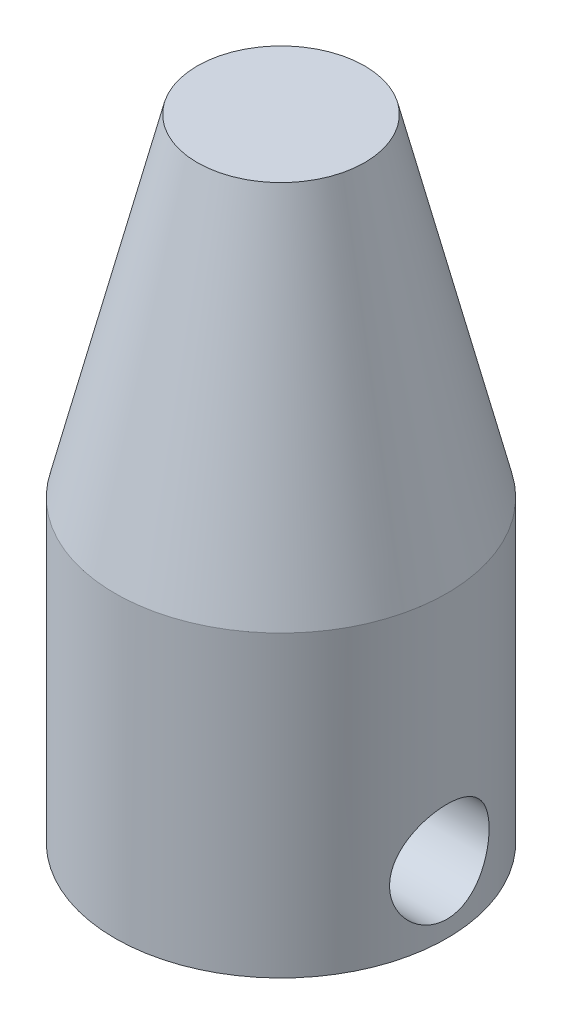
ISO-10303-21;
HEADER;
FILE_DESCRIPTION(('STEP AP214'),'2;1');
FILE_NAME('part.step','',(''),(''),'','','');
FILE_SCHEMA(('AUTOMOTIVE_DESIGN { 1 0 10303 214 1 1 1 1 }'));
ENDSEC;
DATA;
#1=APPLICATION_CONTEXT('core data for automotive mechanical design processes');
#2=APPLICATION_PROTOCOL_DEFINITION('international standard','automotive_design',2000,#1);
#3=PRODUCT_CONTEXT('',#1,'mechanical');
#4=PRODUCT('Part','Part','',(#3));
#5=PRODUCT_RELATED_PRODUCT_CATEGORY('part','',(#4));
#6=PRODUCT_DEFINITION_FORMATION('','',#4);
#7=PRODUCT_DEFINITION_CONTEXT('part definition',#1,'design');
#8=PRODUCT_DEFINITION('design','',#6,#7);
#9=PRODUCT_DEFINITION_SHAPE('','',#8);
#10=(LENGTH_UNIT() NAMED_UNIT(*) SI_UNIT(.MILLI.,.METRE.));
#11=(NAMED_UNIT(*) PLANE_ANGLE_UNIT() SI_UNIT($,.RADIAN.));
#12=(NAMED_UNIT(*) SI_UNIT($,.STERADIAN.) SOLID_ANGLE_UNIT());
#13=UNCERTAINTY_MEASURE_WITH_UNIT(LENGTH_MEASURE(1.E-05),#10,'distance_accuracy_value','');
#14=(GEOMETRIC_REPRESENTATION_CONTEXT(3) GLOBAL_UNCERTAINTY_ASSIGNED_CONTEXT((#13)) GLOBAL_UNIT_ASSIGNED_CONTEXT((#10,
#11,#12)) REPRESENTATION_CONTEXT('',''));
#15=CARTESIAN_POINT('',(0.,0.,0.));
#16=DIRECTION('',(0.,0.,1.));
#17=DIRECTION('',(1.,0.,0.));
#18=AXIS2_PLACEMENT_3D('',#15,#16,#17);
#19=CARTESIAN_POINT('',(0.,9.,0.));
#20=DIRECTION('',(0.,-1.,0.));
#21=DIRECTION('',(0.,0.,-1.));
#22=AXIS2_PLACEMENT_3D('',#19,#20,#21);
#23=CYLINDRICAL_SURFACE('',#22,5.);
#24=CARTESIAN_POINT('',(-5.,0.5,0.));
#25=CARTESIAN_POINT('',(-4.9999992925055,0.500000997484886,-0.0822886127533));
#26=CARTESIAN_POINT('',(-4.99794915693954,0.506793863623966,-0.164587318351529));
#27=CARTESIAN_POINT('',(-4.98997105593691,0.533721354222101,-0.326788125304881));
#28=CARTESIAN_POINT('',(-4.98404193389692,0.553859958023342,-0.40668950441142));
#29=CARTESIAN_POINT('',(-4.96895552501836,0.606746016910264,-0.561732707754527));
#30=CARTESIAN_POINT('',(-4.95980300250425,0.639474869618937,-0.636881364395373));
#31=CARTESIAN_POINT('',(-4.93922109237645,0.716536093055836,-0.780624181053131));
#32=CARTESIAN_POINT('',(-4.92779140192067,0.760870007395417,-0.84921746746967));
#33=CARTESIAN_POINT('',(-4.90350737192774,0.861224007472669,-0.979871797183745));
#34=CARTESIAN_POINT('',(-4.89062383657036,0.917516625885914,-1.04171807124434));
#35=CARTESIAN_POINT('',(-4.86505834210442,1.03960922991018,-1.15524920923324));
#36=CARTESIAN_POINT('',(-4.85237641724501,1.10541081212496,-1.20693236327441));
#37=CARTESIAN_POINT('',(-4.82834113993772,1.24647075303761,-1.29980037723708));
#38=CARTESIAN_POINT('',(-4.81702406663875,1.32190846099074,-1.34072309022213));
#39=CARTESIAN_POINT('',(-4.79743620394031,1.47898925423029,-1.4092139477476));
#40=CARTESIAN_POINT('',(-4.78916468313311,1.56063084392798,-1.43678529919973));
#41=CARTESIAN_POINT('',(-4.77690870838434,1.72539026613046,-1.47701633682652));
#42=CARTESIAN_POINT('',(-4.77281069324533,1.80840274386394,-1.49007196234677));
#43=CARTESIAN_POINT('',(-4.76902789749767,1.97553315621677,-1.50213730614672));
#44=CARTESIAN_POINT('',(-4.76934204760571,2.05965081805909,-1.50115042761078));
#45=CARTESIAN_POINT('',(-4.77424744067778,2.22338390860848,-1.48546977199812));
#46=CARTESIAN_POINT('',(-4.7786838859914,2.30305225036224,-1.47127205262685));
#47=CARTESIAN_POINT('',(-4.79108356228624,2.45881978627346,-1.43037420427056));
#48=CARTESIAN_POINT('',(-4.79904714132351,2.53491862737433,-1.40367284141641));
#49=CARTESIAN_POINT('',(-4.81772733074973,2.68260034966074,-1.33816026653682));
#50=CARTESIAN_POINT('',(-4.82848016115952,2.75410708395526,-1.29918816934642));
#51=CARTESIAN_POINT('',(-4.85150987000065,2.88973202201019,-1.21035222588683));
#52=CARTESIAN_POINT('',(-4.86378711746991,2.95384842941378,-1.16048574002588));
#53=CARTESIAN_POINT('',(-4.88911011297937,3.07568619076202,-1.04881290765546));
#54=CARTESIAN_POINT('',(-4.90216654310498,3.13302866402967,-0.986594907466972));
#55=CARTESIAN_POINT('',(-4.92712244063259,3.23655398406425,-0.853263259313967));
#56=CARTESIAN_POINT('',(-4.9390218351841,3.28273612841443,-0.782149051860888));
#57=CARTESIAN_POINT('',(-4.9604316006947,3.36285992246473,-0.632355038342803));
#58=CARTESIAN_POINT('',(-4.96992543668314,3.39671751624986,-0.55362774974795));
#59=CARTESIAN_POINT('',(-4.98533521832222,3.45059959009963,-0.39124541560352));
#60=CARTESIAN_POINT('',(-4.99125216186999,3.47062792853249,-0.307591751589582));
#61=CARTESIAN_POINT('',(-4.99868364643538,3.49565217789939,-0.140952242668332));
#62=CARTESIAN_POINT('',(-5.0003485041779,3.50116158580161,-0.0580500976011871));
#63=CARTESIAN_POINT('',(-4.9995292324176,3.49843084428792,0.107499605823383));
#64=CARTESIAN_POINT('',(-4.99704565677756,3.49019253034856,0.19014719669078));
#65=CARTESIAN_POINT('',(-4.98830696987163,3.4606153888885,0.350903605309697));
#66=CARTESIAN_POINT('',(-4.98213829799417,3.43957661241913,0.429072772614169));
#67=CARTESIAN_POINT('',(-4.96674347841533,3.3853567672218,0.580754638954522));
#68=CARTESIAN_POINT('',(-4.95751696321085,3.35217423896214,0.654266777025583));
#69=CARTESIAN_POINT('',(-4.93669654351325,3.27374683451887,0.796437189461052));
#70=CARTESIAN_POINT('',(-4.92505280829675,3.22824065905203,0.864943826199669));
#71=CARTESIAN_POINT('',(-4.90073468764318,3.12677524594719,0.993523307980147));
#72=CARTESIAN_POINT('',(-4.8880600443108,3.07081338811233,1.05359403235593));
#73=CARTESIAN_POINT('',(-4.86253171869138,2.94761269163066,1.16585744551027));
#74=CARTESIAN_POINT('',(-4.84968825033268,2.88003812422826,1.21768481231503));
#75=CARTESIAN_POINT('',(-4.82576515238464,2.73687206098647,1.30928995072154));
#76=CARTESIAN_POINT('',(-4.81468547654651,2.66128077544179,1.34906803829472));
#77=CARTESIAN_POINT('',(-4.79567189615055,2.50446750874531,1.41517347127168));
#78=CARTESIAN_POINT('',(-4.78772337843827,2.42327381346341,1.4415634693705));
#79=CARTESIAN_POINT('',(-4.77591594362794,2.25731203106852,1.48021730815114));
#80=CARTESIAN_POINT('',(-4.772055625083,2.17254517921233,1.49248598978779));
#81=CARTESIAN_POINT('',(-4.76899972496087,2.00563848162377,1.50221984485059));
#82=CARTESIAN_POINT('',(-4.76961647442754,1.92353634898242,1.5002805530849));
#83=CARTESIAN_POINT('',(-4.77499401288294,1.7608858966272,1.48307505444813));
#84=CARTESIAN_POINT('',(-4.77975463592551,1.68033751482365,1.46780938124716));
#85=CARTESIAN_POINT('',(-4.79275763670385,1.52405460085715,1.42476888804136));
#86=CARTESIAN_POINT('',(-4.80095604545965,1.44827271263831,1.39715175507068));
#87=CARTESIAN_POINT('',(-4.81990278909136,1.30235756118228,1.33031507121129));
#88=CARTESIAN_POINT('',(-4.83065161194312,1.23222538235924,1.29109329962876));
#89=CARTESIAN_POINT('',(-4.85397676425833,1.09683688347289,1.20048763805072));
#90=CARTESIAN_POINT('',(-4.86660540163798,1.03185123873959,1.14871276092994));
#91=CARTESIAN_POINT('',(-4.89201320450026,0.911297501692137,1.03517434629782));
#92=CARTESIAN_POINT('',(-4.90479240823905,0.855731860532243,0.973408217134502));
#93=CARTESIAN_POINT('',(-4.92950936570649,0.75397658770497,0.839465762183249));
#94=CARTESIAN_POINT('',(-4.94141159765674,0.708108553144511,0.767037885790608));
#95=CARTESIAN_POINT('',(-4.96260680455813,0.629264830095975,0.615141373983529));
#96=CARTESIAN_POINT('',(-4.97190099931067,0.596283111725492,0.535676052998955));
#97=CARTESIAN_POINT('',(-4.98602174969301,0.547104724347251,0.380757712655282));
#98=CARTESIAN_POINT('',(-4.99122027381068,0.529488327116752,0.305786961954234));
#99=CARTESIAN_POINT('',(-4.99820944494492,0.505936474758423,0.15388019523078));
#100=CARTESIAN_POINT('',(-5.0000006615474,0.499999067295181,0.0769445098581397));
#101=CARTESIAN_POINT('',(-5.,0.5,0.));
#102=B_SPLINE_CURVE_WITH_KNOTS('',3,(#24,#25,#26,#27,#28,#29,#30,#31,#32,#33,#34,#35,#36,#37,
#38,#39,#40,#41,#42,#43,#44,#45,#46,#47,#48,#49,#50,#51,#52,#53,#54,#55,#56,#57,#58,#59,#60,#61,
#62,#63,#64,#65,#66,#67,#68,#69,#70,#71,#72,#73,#74,#75,#76,#77,#78,#79,#80,#81,#82,#83,#84,#85,
#86,#87,#88,#89,#90,#91,#92,#93,#94,#95,#96,#97,#98,#99,#100,#101),.UNSPECIFIED.,.T.,.F.,(4,2,2,
2,2,2,2,2,2,2,2,2,2,2,2,2,2,2,2,2,2,2,2,2,2,2,2,2,2,2,2,2,2,2,2,2,2,2,4),(0.,0.246583203612611,
0.493239964846,0.739533676300874,0.985860164412702,1.23855602948191,1.49129437288633,
1.74971481004109,2.00807314543224,2.25919689356599,2.51025978319089,2.75226016697676,
2.99428443658001,3.23962426447119,3.48502360158555,3.74067104048166,3.99633456531071,
4.25371046881688,4.51101453528808,4.75908809438545,5.00712853550327,5.24956746682327,
5.49203554593728,5.74011305702908,5.98825282000191,6.24540400322818,6.5025484425268,
6.75847814951252,7.01432009460283,7.25950155466943,7.504673196616,7.74680040402721,
7.98897397553107,8.23996925679931,8.49102974897502,8.74942996156671,9.00770911595235,
9.23831691930459,9.46888616948874),.UNSPECIFIED.);
#103=CARTESIAN_POINT('',(-5.,0.5,0.));
#104=VERTEX_POINT('',#103);
#105=EDGE_CURVE('E11',#104,#104,#102,.T.);
#106=ORIENTED_EDGE('',*,*,#105,.T.);
#107=EDGE_LOOP('',(#106));
#108=FACE_BOUND('',#107,.T.);
#109=CARTESIAN_POINT('',(4.76969600708473,2.,-1.5));
#110=CARTESIAN_POINT('',(4.7696968572698,1.9178054520576,-1.49999897633764));
#111=CARTESIAN_POINT('',(4.77184390209069,1.83560077585598,-1.49322108167142));
#112=CARTESIAN_POINT('',(4.780165783029,1.67359475040806,-1.46635844446749));
#113=CARTESIAN_POINT('',(4.78634196493468,1.59379421349853,-1.44626925573578));
#114=CARTESIAN_POINT('',(4.80196102485632,1.43896527172827,-1.39352753269955));
#115=CARTESIAN_POINT('',(4.81139846703232,1.36392917036691,-1.36089589394243));
#116=CARTESIAN_POINT('',(4.83246932547567,1.2203780660047,-1.28406421917929));
#117=CARTESIAN_POINT('',(4.84410307041019,1.15186404131556,-1.23986245137053));
#118=CARTESIAN_POINT('',(4.86866862185765,1.02113360942262,-1.13964754141627));
#119=CARTESIAN_POINT('',(4.88162808311636,0.959154102053713,-1.08333207175807));
#120=CARTESIAN_POINT('',(4.90714861936757,0.845362048677491,-0.961136237579599));
#121=CARTESIAN_POINT('',(4.91970964297705,0.793550809550121,-0.895254645461111));
#122=CARTESIAN_POINT('',(4.94333214579389,0.700537300166693,-0.75411143779369));
#123=CARTESIAN_POINT('',(4.95435724342404,0.659576575557191,-0.678684021335815));
#124=CARTESIAN_POINT('',(4.97334435920684,0.591012740957243,-0.521624645369354));
#125=CARTESIAN_POINT('',(4.98130703789495,0.563406750142551,-0.439994028387912));
#126=CARTESIAN_POINT('',(4.99307646003589,0.523119998909491,-0.27532385263083));
#127=CARTESIAN_POINT('',(4.99699557369338,0.510034872347297,-0.192391398953801));
#128=CARTESIAN_POINT('',(5.00063201501348,0.497882675353559,-0.025421823749315));
#129=CARTESIAN_POINT('',(5.00035022521079,0.498812660598037,0.0586150620503682));
#130=CARTESIAN_POINT('',(4.99569603817659,0.514392868543023,0.22257115660016));
#131=CARTESIAN_POINT('',(4.9914542020526,0.528605193809869,0.302536267641341));
#132=CARTESIAN_POINT('',(4.97951522112593,0.56963133599429,0.458889213442527));
#133=CARTESIAN_POINT('',(4.97181785750586,0.596445950942671,0.535276821322846));
#134=CARTESIAN_POINT('',(4.95365220986963,0.662212023418558,0.683347326351281));
#135=CARTESIAN_POINT('',(4.94315269676706,0.701301202807267,0.754965064694478));
#136=CARTESIAN_POINT('',(4.92049640648069,0.790397852428228,0.890764673783156));
#137=CARTESIAN_POINT('',(4.90833923637778,0.840407912963484,0.954944774872131));
#138=CARTESIAN_POINT('',(4.88311550488165,0.952197750751597,1.0766604815298));
#139=CARTESIAN_POINT('',(4.87003195321461,1.01435691902974,1.13384458040111));
#140=CARTESIAN_POINT('',(4.84483979887497,1.14751001789005,1.23707651539824));
#141=CARTESIAN_POINT('',(4.8327312931702,1.21850482538923,1.28312324482853));
#142=CARTESIAN_POINT('',(4.81077903197678,1.36823946924899,1.3631399533545));
#143=CARTESIAN_POINT('',(4.80095810695957,1.44704704586292,1.39698989237679));
#144=CARTESIAN_POINT('',(4.78496392548436,1.60960720844554,1.45083362878413));
#145=CARTESIAN_POINT('',(4.7787894791583,1.69335817153456,1.4708319464056));
#146=CARTESIAN_POINT('',(4.77104849541241,1.86008236073928,1.49574770282165));
#147=CARTESIAN_POINT('',(4.7693187867044,1.94296822389398,1.50119946380212));
#148=CARTESIAN_POINT('',(4.77021192441924,2.10847290000987,1.49835947233062));
#149=CARTESIAN_POINT('',(4.77283416156589,2.19109174873085,1.4900696437133));
#150=CARTESIAN_POINT('',(4.78197558554912,2.35148837797087,1.4604576357419));
#151=CARTESIAN_POINT('',(4.78839176507489,2.42933616426352,1.4394796143128));
#152=CARTESIAN_POINT('',(4.80429141231227,2.58040169081492,1.3854857774794));
#153=CARTESIAN_POINT('',(4.81377535359073,2.65361871414057,1.3524681034276));
#154=CARTESIAN_POINT('',(4.83505835023047,2.79551746407213,1.274318711965));
#155=CARTESIAN_POINT('',(4.84691271069799,2.86402472098579,1.22888564172729));
#156=CARTESIAN_POINT('',(4.87148205646987,2.9926381061808,1.12755301600385));
#157=CARTESIAN_POINT('',(4.88419724730003,3.05274221761279,1.07165095534897));
#158=CARTESIAN_POINT('',(4.90963633548158,3.16518040581474,0.948455132493599));
#159=CARTESIAN_POINT('',(4.92234245063004,3.21713562898698,0.880811065857434));
#160=CARTESIAN_POINT('',(4.94584851748651,3.30896670102775,0.737461784590249));
#161=CARTESIAN_POINT('',(4.95664856384717,3.34884314978146,0.661756970543944));
#162=CARTESIAN_POINT('',(4.97505970474957,3.4150000305683,0.504935504705222));
#163=CARTESIAN_POINT('',(4.98269453424966,3.44138201615898,0.423864622037839));
#164=CARTESIAN_POINT('',(4.99401979596827,3.48006091889042,0.258169966504588));
#165=CARTESIAN_POINT('',(4.9977113567088,3.49236186594842,0.173547217354763));
#166=CARTESIAN_POINT('',(5.00066544081399,3.5022230440545,0.00665215388274265));
#167=CARTESIAN_POINT('',(5.00009305111322,3.50033269540783,-0.0755851790862068));
#168=CARTESIAN_POINT('',(4.99497264465037,3.48317836750088,-0.238519481164404));
#169=CARTESIAN_POINT('',(4.99042485330462,3.46791514651956,-0.319216537346529));
#170=CARTESIAN_POINT('',(4.97791168358327,3.42478833860038,-0.475935813041358));
#171=CARTESIAN_POINT('',(4.96998352900866,3.39706181935099,-0.551998927351392));
#172=CARTESIAN_POINT('',(4.9515294303945,3.32991808549281,-0.698433237752053));
#173=CARTESIAN_POINT('',(4.94100305949946,3.29049894971381,-0.76880349605058));
#174=CARTESIAN_POINT('',(4.91803965828228,3.19962654256996,-0.904301892420563));
#175=CARTESIAN_POINT('',(4.90555226923559,3.14782856999923,-0.969190250076767));
#176=CARTESIAN_POINT('',(4.88023537212334,3.0342896116672,-1.08953757134594));
#177=CARTESIAN_POINT('',(4.86740576641079,2.97254576210185,-1.14499380960194));
#178=CARTESIAN_POINT('',(4.84240680631319,2.83865922168949,-1.24656269394549));
#179=CARTESIAN_POINT('',(4.83026852693485,2.76626144660956,-1.29234759757956));
#180=CARTESIAN_POINT('',(4.80852547508793,2.61444482583898,-1.37104313528776));
#181=CARTESIAN_POINT('',(4.79891948596956,2.53502937639881,-1.40395995557289));
#182=CARTESIAN_POINT('',(4.78427816717594,2.38025956839373,-1.4530194253295));
#183=CARTESIAN_POINT('',(4.7788615484052,2.30539135306901,-1.47058859011232));
#184=CARTESIAN_POINT('',(4.77157042597167,2.15368477750423,-1.49407818835144));
#185=CARTESIAN_POINT('',(4.7696952122143,2.07684681535475,-1.50000095706095));
#186=CARTESIAN_POINT('',(4.76969600708473,2.,-1.5));
#187=B_SPLINE_CURVE_WITH_KNOTS('',3,(#109,#110,#111,#112,#113,#114,#115,#116,#117,#118,#119,
#120,#121,#122,#123,#124,#125,#126,#127,#128,#129,#130,#131,#132,#133,#134,#135,#136,#137,#138,
#139,#140,#141,#142,#143,#144,#145,#146,#147,#148,#149,#150,#151,#152,#153,#154,#155,#156,#157,
#158,#159,#160,#161,#162,#163,#164,#165,#166,#167,#168,#169,#170,#171,#172,#173,#174,#175,#176,
#177,#178,#179,#180,#181,#182,#183,#184,#185,#186),.UNSPECIFIED.,.T.,.F.,(4,2,2,2,2,2,2,2,2,2,2,
2,2,2,2,2,2,2,2,2,2,2,2,2,2,2,2,2,2,2,2,2,2,2,2,2,2,2,4),(0.,0.246300165915542,0.492682641689,
0.738656414466193,0.984667025370101,1.23773150007984,1.49082847871273,1.74915939273645,
2.00743455587877,2.25832140149558,2.5091555410144,2.7520012599088,2.99486235890376,
3.24055209335676,3.4863001659083,3.74152147023278,3.99676812491863,4.25446238246266,
4.51207250628411,4.76008080790309,5.00805439107388,5.24958594938817,5.49115481045787,
5.73920731809388,5.98731925928923,6.24479506100602,6.50225807324202,6.75775391814325,
7.01317662321682,7.2587630391122,7.50433553047755,7.74727096872219,7.99024634491378,
8.24099627054488,8.4918185262989,8.75011639669147,9.00828993963944,9.23861153857447,
9.4688869503356),.UNSPECIFIED.);
#188=CARTESIAN_POINT('',(4.76969600708473,2.,-1.5));
#189=VERTEX_POINT('',#188);
#190=EDGE_CURVE('E41',#189,#189,#187,.T.);
#191=ORIENTED_EDGE('',*,*,#190,.T.);
#192=EDGE_LOOP('',(#191));
#193=FACE_BOUND('',#192,.T.);
#194=CARTESIAN_POINT('',(0.,9.,0.));
#195=DIRECTION('',(0.,-1.,0.));
#196=DIRECTION('',(0.,0.,-1.));
#197=AXIS2_PLACEMENT_3D('',#194,#195,#196);
#198=CIRCLE('',#197,5.);
#199=CARTESIAN_POINT('',(0.,9.,-5.));
#200=VERTEX_POINT('',#199);
#201=EDGE_CURVE('E46',#200,#200,#198,.F.);
#202=ORIENTED_EDGE('',*,*,#201,.F.);
#203=EDGE_LOOP('',(#202));
#204=FACE_BOUND('',#203,.T.);
#205=CARTESIAN_POINT('',(0.,0.,0.));
#206=DIRECTION('',(0.,1.,0.));
#207=DIRECTION('',(0.,0.,1.));
#208=AXIS2_PLACEMENT_3D('',#205,#206,#207);
#209=CIRCLE('',#208,5.);
#210=CARTESIAN_POINT('',(0.,0.,5.));
#211=VERTEX_POINT('',#210);
#212=EDGE_CURVE('E72',#211,#211,#209,.T.);
#213=ORIENTED_EDGE('',*,*,#212,.T.);
#214=EDGE_LOOP('',(#213));
#215=FACE_BOUND('',#214,.T.);
#216=ADVANCED_FACE('F33',(#108,#193,#204,#215),#23,.T.);
#217=CARTESIAN_POINT('',(0.,0.,0.));
#218=DIRECTION('',(0.,1.,0.));
#219=DIRECTION('',(0.,0.,1.));
#220=AXIS2_PLACEMENT_3D('',#217,#218,#219);
#221=PLANE('',#220);
#222=ORIENTED_EDGE('',*,*,#212,.F.);
#223=EDGE_LOOP('',(#222));
#224=FACE_BOUND('',#223,.T.);
#225=ADVANCED_FACE('F59',(#224),#221,.F.);
#226=CARTESIAN_POINT('',(-5.,2.,0.));
#227=DIRECTION('',(1.,0.,0.));
#228=DIRECTION('',(0.,0.,-1.));
#229=AXIS2_PLACEMENT_3D('',#226,#227,#228);
#230=CYLINDRICAL_SURFACE('',#229,1.5);
#231=ORIENTED_EDGE('',*,*,#190,.F.);
#232=EDGE_LOOP('',(#231));
#233=FACE_BOUND('',#232,.T.);
#234=ORIENTED_EDGE('',*,*,#105,.F.);
#235=EDGE_LOOP('',(#234));
#236=FACE_BOUND('',#235,.T.);
#237=ADVANCED_FACE('F54',(#233,#236),#230,.F.);
#238=CARTESIAN_POINT('',(0.,19.,0.));
#239=DIRECTION('',(0.,1.,0.));
#240=DIRECTION('',(0.,0.,1.));
#241=AXIS2_PLACEMENT_3D('',#238,#239,#240);
#242=PLANE('',#241);
#243=CARTESIAN_POINT('',(0.,19.,0.));
#244=DIRECTION('',(0.,1.,0.));
#245=DIRECTION('',(0.,0.,1.));
#246=AXIS2_PLACEMENT_3D('',#243,#244,#245);
#247=CIRCLE('',#246,2.523);
#248=CARTESIAN_POINT('',(0.,19.,2.523));
#249=VERTEX_POINT('',#248);
#250=EDGE_CURVE('E74',#249,#249,#247,.T.);
#251=ORIENTED_EDGE('',*,*,#250,.T.);
#252=EDGE_LOOP('',(#251));
#253=FACE_BOUND('',#252,.T.);
#254=ADVANCED_FACE('F58',(#253),#242,.T.);
#255=CARTESIAN_POINT('',(0.,19.,0.));
#256=DIRECTION('',(0.,-1.,0.));
#257=DIRECTION('',(0.,0.,-1.));
#258=AXIS2_PLACEMENT_3D('',#255,#256,#257);
#259=CONICAL_SURFACE('',#258,2.523,0.242812788509019);
#260=ORIENTED_EDGE('',*,*,#250,.F.);
#261=EDGE_LOOP('',(#260));
#262=FACE_BOUND('',#261,.T.);
#263=ORIENTED_EDGE('',*,*,#201,.T.);
#264=EDGE_LOOP('',(#263));
#265=FACE_BOUND('',#264,.T.);
#266=ADVANCED_FACE('F61',(#262,#265),#259,.T.);
#267=CLOSED_SHELL('',(#216,#225,#237,#254,#266));
#268=MANIFOLD_SOLID_BREP('B2',#267);
#269=ADVANCED_BREP_SHAPE_REPRESENTATION('',(#18,#268),#14);
#270=SHAPE_DEFINITION_REPRESENTATION(#9,#269);
ENDSEC;
END-ISO-10303-21;
